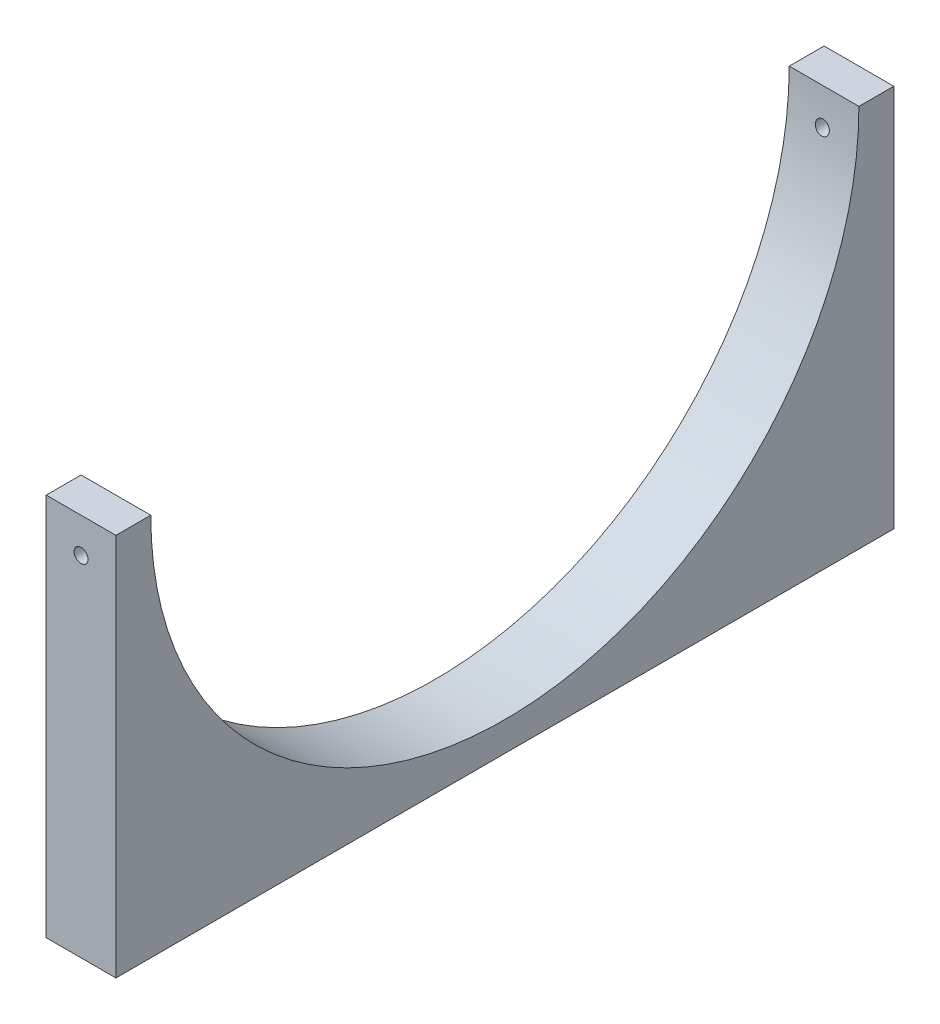
ISO-10303-21;
HEADER;
FILE_DESCRIPTION(('STEP AP214'),'2;1');
FILE_NAME('part.step','',(''),(''),'','','');
FILE_SCHEMA(('AUTOMOTIVE_DESIGN { 1 0 10303 214 1 1 1 1 }'));
ENDSEC;
DATA;
#1=APPLICATION_CONTEXT('core data for automotive mechanical design processes');
#2=APPLICATION_PROTOCOL_DEFINITION('international standard','automotive_design',2000,#1);
#3=PRODUCT_CONTEXT('',#1,'mechanical');
#4=PRODUCT('Part','Part','',(#3));
#5=PRODUCT_RELATED_PRODUCT_CATEGORY('part','',(#4));
#6=PRODUCT_DEFINITION_FORMATION('','',#4);
#7=PRODUCT_DEFINITION_CONTEXT('part definition',#1,'design');
#8=PRODUCT_DEFINITION('design','',#6,#7);
#9=PRODUCT_DEFINITION_SHAPE('','',#8);
#10=(LENGTH_UNIT() NAMED_UNIT(*) SI_UNIT(.MILLI.,.METRE.));
#11=(NAMED_UNIT(*) PLANE_ANGLE_UNIT() SI_UNIT($,.RADIAN.));
#12=(NAMED_UNIT(*) SI_UNIT($,.STERADIAN.) SOLID_ANGLE_UNIT());
#13=UNCERTAINTY_MEASURE_WITH_UNIT(LENGTH_MEASURE(1.E-05),#10,'distance_accuracy_value','');
#14=(GEOMETRIC_REPRESENTATION_CONTEXT(3) GLOBAL_UNCERTAINTY_ASSIGNED_CONTEXT((#13)) GLOBAL_UNIT_ASSIGNED_CONTEXT((#10,
#11,#12)) REPRESENTATION_CONTEXT('',''));
#15=CARTESIAN_POINT('',(0.,0.,0.));
#16=DIRECTION('',(0.,0.,1.));
#17=DIRECTION('',(1.,0.,0.));
#18=AXIS2_PLACEMENT_3D('',#15,#16,#17);
#19=CARTESIAN_POINT('',(-68.4090909090909,80.,57.85));
#20=DIRECTION('',(1.,0.,0.));
#21=DIRECTION('',(0.,0.,-1.));
#22=AXIS2_PLACEMENT_3D('',#19,#20,#21);
#23=PLANE('',#22);
#24=DIRECTION('',(0.,-1.,0.));
#25=VECTOR('',#24,1.);
#26=CARTESIAN_POINT('',(-68.4090909090909,80.,57.85));
#27=LINE('',#26,#25);
#28=CARTESIAN_POINT('',(-68.4090909090909,55.,57.85));
#29=VERTEX_POINT('',#28);
#30=CARTESIAN_POINT('',(-68.4090909090909,0.,57.85));
#31=VERTEX_POINT('',#30);
#32=EDGE_CURVE('E45',#29,#31,#27,.T.);
#33=ORIENTED_EDGE('',*,*,#32,.F.);
#34=DIRECTION('',(0.,0.,1.));
#35=VECTOR('',#34,1.);
#36=CARTESIAN_POINT('',(-68.4090909090909,55.,0.));
#37=LINE('',#36,#35);
#38=CARTESIAN_POINT('',(-68.4090909090909,55.,52.85));
#39=VERTEX_POINT('',#38);
#40=EDGE_CURVE('E107',#39,#29,#37,.T.);
#41=ORIENTED_EDGE('',*,*,#40,.F.);
#42=CARTESIAN_POINT('',(-68.4090909090909,55.,2.04999999999999));
#43=DIRECTION('',(-1.,0.,0.));
#44=DIRECTION('',(0.,0.,1.));
#45=AXIS2_PLACEMENT_3D('',#42,#43,#44);
#46=CIRCLE('',#45,50.8);
#47=CARTESIAN_POINT('',(-68.4090909090909,55.,-48.75));
#48=VERTEX_POINT('',#47);
#49=EDGE_CURVE('E186',#48,#39,#46,.T.);
#50=ORIENTED_EDGE('',*,*,#49,.F.);
#51=DIRECTION('',(0.,0.,1.));
#52=VECTOR('',#51,1.);
#53=CARTESIAN_POINT('',(-68.4090909090909,55.,0.));
#54=LINE('',#53,#52);
#55=CARTESIAN_POINT('',(-68.4090909090909,55.,-53.75));
#56=VERTEX_POINT('',#55);
#57=EDGE_CURVE('E180',#56,#48,#54,.T.);
#58=ORIENTED_EDGE('',*,*,#57,.F.);
#59=DIRECTION('',(0.,-1.,0.));
#60=VECTOR('',#59,1.);
#61=CARTESIAN_POINT('',(-68.4090909090909,80.,-53.75));
#62=LINE('',#61,#60);
#63=CARTESIAN_POINT('',(-68.4090909090909,0.,-53.75));
#64=VERTEX_POINT('',#63);
#65=EDGE_CURVE('E124',#56,#64,#62,.T.);
#66=ORIENTED_EDGE('',*,*,#65,.T.);
#67=DIRECTION('',(0.,0.,1.));
#68=VECTOR('',#67,1.);
#69=CARTESIAN_POINT('',(-68.4090909090909,0.,57.85));
#70=LINE('',#69,#68);
#71=EDGE_CURVE('E109',#64,#31,#70,.T.);
#72=ORIENTED_EDGE('',*,*,#71,.T.);
#73=EDGE_LOOP('',(#33,#41,#50,#58,#66,#72));
#74=FACE_BOUND('',#73,.T.);
#75=ADVANCED_FACE('F32',(#74),#23,.F.);
#76=CARTESIAN_POINT('',(-68.4090909090909,80.,57.85));
#77=DIRECTION('',(0.,0.,-1.));
#78=DIRECTION('',(-1.,0.,0.));
#79=AXIS2_PLACEMENT_3D('',#76,#77,#78);
#80=PLANE('',#79);
#81=CARTESIAN_POINT('',(-63.4090909090909,50.,57.85));
#82=DIRECTION('',(0.,0.,-1.));
#83=DIRECTION('',(-1.,0.,0.));
#84=AXIS2_PLACEMENT_3D('',#81,#82,#83);
#85=CIRCLE('',#84,0.999999999999998);
#86=CARTESIAN_POINT('',(-64.4090909090909,50.,57.85));
#87=VERTEX_POINT('',#86);
#88=EDGE_CURVE('E202',#87,#87,#85,.T.);
#89=ORIENTED_EDGE('',*,*,#88,.T.);
#90=EDGE_LOOP('',(#89));
#91=FACE_BOUND('',#90,.T.);
#92=DIRECTION('',(1.,0.,0.));
#93=VECTOR('',#92,1.);
#94=CARTESIAN_POINT('',(-68.4090909090909,0.,57.85));
#95=LINE('',#94,#93);
#96=CARTESIAN_POINT('',(-58.4090909090909,0.,57.85));
#97=VERTEX_POINT('',#96);
#98=EDGE_CURVE('E102',#31,#97,#95,.T.);
#99=ORIENTED_EDGE('',*,*,#98,.T.);
#100=DIRECTION('',(0.,1.,0.));
#101=VECTOR('',#100,1.);
#102=CARTESIAN_POINT('',(-58.4090909090909,80.,57.85));
#103=LINE('',#102,#101);
#104=CARTESIAN_POINT('',(-58.4090909090909,55.,57.85));
#105=VERTEX_POINT('',#104);
#106=EDGE_CURVE('E91',#97,#105,#103,.T.);
#107=ORIENTED_EDGE('',*,*,#106,.T.);
#108=DIRECTION('',(-1.,0.,0.));
#109=VECTOR('',#108,1.);
#110=CARTESIAN_POINT('',(121.090909090909,55.,57.85));
#111=LINE('',#110,#109);
#112=EDGE_CURVE('E99',#105,#29,#111,.T.);
#113=ORIENTED_EDGE('',*,*,#112,.T.);
#114=ORIENTED_EDGE('',*,*,#32,.T.);
#115=EDGE_LOOP('',(#99,#107,#113,#114));
#116=FACE_BOUND('',#115,.T.);
#117=ADVANCED_FACE('F98',(#91,#116),#80,.F.);
#118=CARTESIAN_POINT('',(-68.4090909090909,80.,-53.75));
#119=DIRECTION('',(0.,0.,1.));
#120=DIRECTION('',(1.,0.,0.));
#121=AXIS2_PLACEMENT_3D('',#118,#119,#120);
#122=PLANE('',#121);
#123=CARTESIAN_POINT('',(-63.4090909090909,50.,-53.75));
#124=DIRECTION('',(0.,0.,1.));
#125=DIRECTION('',(1.,0.,0.));
#126=AXIS2_PLACEMENT_3D('',#123,#124,#125);
#127=CIRCLE('',#126,0.999999999999998);
#128=CARTESIAN_POINT('',(-62.4090909090909,50.,-53.75));
#129=VERTEX_POINT('',#128);
#130=EDGE_CURVE('E131',#129,#129,#127,.T.);
#131=ORIENTED_EDGE('',*,*,#130,.T.);
#132=EDGE_LOOP('',(#131));
#133=FACE_BOUND('',#132,.T.);
#134=DIRECTION('',(-1.,0.,0.));
#135=VECTOR('',#134,1.);
#136=CARTESIAN_POINT('',(121.090909090909,55.,-53.75));
#137=LINE('',#136,#135);
#138=CARTESIAN_POINT('',(-58.4090909090909,55.,-53.75));
#139=VERTEX_POINT('',#138);
#140=EDGE_CURVE('E120',#139,#56,#137,.T.);
#141=ORIENTED_EDGE('',*,*,#140,.F.);
#142=DIRECTION('',(0.,-1.,0.));
#143=VECTOR('',#142,1.);
#144=CARTESIAN_POINT('',(-58.4090909090909,80.,-53.75));
#145=LINE('',#144,#143);
#146=CARTESIAN_POINT('',(-58.4090909090909,0.,-53.75));
#147=VERTEX_POINT('',#146);
#148=EDGE_CURVE('E178',#139,#147,#145,.T.);
#149=ORIENTED_EDGE('',*,*,#148,.T.);
#150=DIRECTION('',(-1.,0.,0.));
#151=VECTOR('',#150,1.);
#152=CARTESIAN_POINT('',(-68.4090909090909,0.,-53.75));
#153=LINE('',#152,#151);
#154=EDGE_CURVE('E60',#147,#64,#153,.T.);
#155=ORIENTED_EDGE('',*,*,#154,.T.);
#156=ORIENTED_EDGE('',*,*,#65,.F.);
#157=EDGE_LOOP('',(#141,#149,#155,#156));
#158=FACE_BOUND('',#157,.T.);
#159=ADVANCED_FACE('F171',(#133,#158),#122,.F.);
#160=CARTESIAN_POINT('',(0.,0.,0.));
#161=DIRECTION('',(0.,-1.,0.));
#162=DIRECTION('',(0.,0.,-1.));
#163=AXIS2_PLACEMENT_3D('',#160,#161,#162);
#164=PLANE('',#163);
#165=CARTESIAN_POINT('',(-63.4090909090909,0.,42.85));
#166=DIRECTION('',(0.,-1.,0.));
#167=DIRECTION('',(0.,0.,-1.));
#168=AXIS2_PLACEMENT_3D('',#165,#166,#167);
#169=CIRCLE('',#168,2.);
#170=CARTESIAN_POINT('',(-63.4090909090909,0.,40.85));
#171=VERTEX_POINT('',#170);
#172=EDGE_CURVE('E195',#171,#171,#169,.T.);
#173=ORIENTED_EDGE('',*,*,#172,.F.);
#174=EDGE_LOOP('',(#173));
#175=FACE_BOUND('',#174,.T.);
#176=CARTESIAN_POINT('',(-63.4090909090909,0.,-38.75));
#177=DIRECTION('',(0.,-1.,0.));
#178=DIRECTION('',(0.,0.,-1.));
#179=AXIS2_PLACEMENT_3D('',#176,#177,#178);
#180=CIRCLE('',#179,2.);
#181=CARTESIAN_POINT('',(-63.4090909090909,0.,-40.75));
#182=VERTEX_POINT('',#181);
#183=EDGE_CURVE('E198',#182,#182,#180,.T.);
#184=ORIENTED_EDGE('',*,*,#183,.F.);
#185=EDGE_LOOP('',(#184));
#186=FACE_BOUND('',#185,.T.);
#187=DIRECTION('',(0.,0.,-1.));
#188=VECTOR('',#187,1.);
#189=CARTESIAN_POINT('',(-58.4090909090909,0.,0.));
#190=LINE('',#189,#188);
#191=EDGE_CURVE('E177',#97,#147,#190,.T.);
#192=ORIENTED_EDGE('',*,*,#191,.F.);
#193=ORIENTED_EDGE('',*,*,#98,.F.);
#194=ORIENTED_EDGE('',*,*,#71,.F.);
#195=ORIENTED_EDGE('',*,*,#154,.F.);
#196=EDGE_LOOP('',(#192,#193,#194,#195));
#197=FACE_BOUND('',#196,.T.);
#198=ADVANCED_FACE('F176',(#175,#186,#197),#164,.T.);
#199=CARTESIAN_POINT('',(121.090909090909,55.,2.04999999999999));
#200=DIRECTION('',(-1.,0.,0.));
#201=DIRECTION('',(0.,0.,1.));
#202=AXIS2_PLACEMENT_3D('',#199,#200,#201);
#203=CYLINDRICAL_SURFACE('',#202,50.8);
#204=CARTESIAN_POINT('',(-62.4090909090909,50.,-48.5033381687105));
#205=CARTESIAN_POINT('',(-62.4090933874529,49.9435620160366,-48.497756008445));
#206=CARTESIAN_POINT('',(-62.413884475844,49.8870923508728,-48.4920745278555));
#207=CARTESIAN_POINT('',(-62.4329253949911,49.7757242294883,-48.4806846062044));
#208=CARTESIAN_POINT('',(-62.4471867918813,49.7208277802709,-48.4749761406609));
#209=CARTESIAN_POINT('',(-62.484767817317,49.6142309306179,-48.4637245007275));
#210=CARTESIAN_POINT('',(-62.5080835130466,49.5625291538337,-48.4581812556967));
#211=CARTESIAN_POINT('',(-62.5631180058667,49.4637872045508,-48.4474535739106));
#212=CARTESIAN_POINT('',(-62.5948346364843,49.4167458344956,-48.4422690450821));
#213=CARTESIAN_POINT('',(-62.6657439697373,49.3287135166166,-48.4324570737672));
#214=CARTESIAN_POINT('',(-62.704927167469,49.2877149927041,-48.4278289350848));
#215=CARTESIAN_POINT('',(-62.7896982780352,49.2128856180934,-48.4193048216092));
#216=CARTESIAN_POINT('',(-62.83528628288,49.1790548703838,-48.4154088573361));
#217=CARTESIAN_POINT('',(-62.9313162123638,49.1197158630582,-48.4085290049929));
#218=CARTESIAN_POINT('',(-62.9817310717293,49.0941643566381,-48.405540382743));
#219=CARTESIAN_POINT('',(-63.0861833304611,49.051894219118,-48.4005747575919));
#220=CARTESIAN_POINT('',(-63.1402205823634,49.035175228701,-48.3985977135387));
#221=CARTESIAN_POINT('',(-63.2500200355732,49.0111445384663,-48.3957506360004));
#222=CARTESIAN_POINT('',(-63.3057693018917,49.0037745306039,-48.3948737414468));
#223=CARTESIAN_POINT('',(-63.4177205921215,48.9984683671669,-48.3942427405686));
#224=CARTESIAN_POINT('',(-63.4739226038204,49.0005319579756,-48.3944886040593));
#225=CARTESIAN_POINT('',(-63.5849828771889,49.0140078552024,-48.3960894700018));
#226=CARTESIAN_POINT('',(-63.6398450586884,49.0253883445857,-48.3974406976435));
#227=CARTESIAN_POINT('',(-63.7468716775122,49.0571216171105,-48.4011887835919));
#228=CARTESIAN_POINT('',(-63.7990361023978,49.0774744416172,-48.4035856467192));
#229=CARTESIAN_POINT('',(-63.8992882253376,49.1265998439225,-48.4093279794881));
#230=CARTESIAN_POINT('',(-63.9473689160589,49.1553865314657,-48.4126750385018));
#231=CARTESIAN_POINT('',(-64.0380184983337,49.2205349309665,-48.420177879442));
#232=CARTESIAN_POINT('',(-64.0805872371506,49.2568968527616,-48.4243336837709));
#233=CARTESIAN_POINT('',(-64.1592636171734,49.3363845366288,-48.4333147166642));
#234=CARTESIAN_POINT('',(-64.1953335199109,49.3795472386392,-48.4381435835443));
#235=CARTESIAN_POINT('',(-64.2597234354509,49.4712618349689,-48.4482690752289));
#236=CARTESIAN_POINT('',(-64.2880431807607,49.5198139152188,-48.4535657161701));
#237=CARTESIAN_POINT('',(-64.3363032847134,49.6212510581529,-48.4644699514475));
#238=CARTESIAN_POINT('',(-64.3561918628569,49.6741605791374,-48.4700792345579));
#239=CARTESIAN_POINT('',(-64.3867884686701,49.7825616990377,-48.4813893093515));
#240=CARTESIAN_POINT('',(-64.3974963002978,49.8380533530647,-48.4870901029861));
#241=CARTESIAN_POINT('',(-64.4094485699878,49.950235631553,-48.49842299441));
#242=CARTESIAN_POINT('',(-64.4106626810285,50.0069295186852,-48.5040548147189));
#243=CARTESIAN_POINT('',(-64.4035042059924,50.1197338342296,-48.5150691107452));
#244=CARTESIAN_POINT('',(-64.3951316172971,50.1758442624823,-48.5204515863945));
#245=CARTESIAN_POINT('',(-64.3690319983901,50.2858426935729,-48.5308241558067));
#246=CARTESIAN_POINT('',(-64.3513114727351,50.339732213705,-48.5358145196412));
#247=CARTESIAN_POINT('',(-64.3070070254242,50.4437835800137,-48.5452925057123));
#248=CARTESIAN_POINT('',(-64.280423244328,50.49394548529,-48.5497801359202));
#249=CARTESIAN_POINT('',(-64.2192384233192,50.5889328787078,-48.5581491074431));
#250=CARTESIAN_POINT('',(-64.1846644441443,50.6337756226786,-48.5620324227539));
#251=CARTESIAN_POINT('',(-64.1084234462943,50.7170212080948,-48.5691450105825));
#252=CARTESIAN_POINT('',(-64.0667565720441,50.7554241806346,-48.5723742964145));
#253=CARTESIAN_POINT('',(-63.9776896219598,50.8245364927184,-48.5781216911418));
#254=CARTESIAN_POINT('',(-63.9303127820543,50.8552755493827,-48.5806425519773));
#255=CARTESIAN_POINT('',(-63.8310412032617,50.9083645111594,-48.5849605665126));
#256=CARTESIAN_POINT('',(-63.779146547988,50.9307145714905,-48.5867577336028));
#257=CARTESIAN_POINT('',(-63.672483766756,50.9663207553611,-48.5896065548862));
#258=CARTESIAN_POINT('',(-63.6177249194976,50.9796044969548,-48.5906604735115));
#259=CARTESIAN_POINT('',(-63.5067461779858,50.9968030716875,-48.5920229649742));
#260=CARTESIAN_POINT('',(-63.4505262968954,51.0007179892047,-48.5923315445243));
#261=CARTESIAN_POINT('',(-63.3383160847669,50.9990668005034,-48.5922011176231));
#262=CARTESIAN_POINT('',(-63.2823255313888,50.9935156641947,-48.591763291561));
#263=CARTESIAN_POINT('',(-63.1720742494544,50.9731217272199,-48.5901456813805));
#264=CARTESIAN_POINT('',(-63.1178135190194,50.9582789366454,-48.588965898068));
#265=CARTESIAN_POINT('',(-63.0125585268903,50.9197300402157,-48.5858743230843));
#266=CARTESIAN_POINT('',(-62.9615643549932,50.8960236908255,-48.5839625113));
#267=CARTESIAN_POINT('',(-62.8642862684319,50.8404321248854,-48.5794259246));
#268=CARTESIAN_POINT('',(-62.8180021908591,50.8085471913436,-48.5768011743545));
#269=CARTESIAN_POINT('',(-62.7313777979121,50.737461193199,-48.5708655926282));
#270=CARTESIAN_POINT('',(-62.6910464262136,50.6982493164981,-48.5675537464183));
#271=CARTESIAN_POINT('',(-62.6175279340673,50.6136520986468,-48.5602929311535));
#272=CARTESIAN_POINT('',(-62.5843426783417,50.56826515119,-48.5563437962723));
#273=CARTESIAN_POINT('',(-62.5259459137532,50.4724561261601,-48.5478622664596));
#274=CARTESIAN_POINT('',(-62.5007630062593,50.4220168168641,-48.5433278590879));
#275=CARTESIAN_POINT('',(-62.4592464932739,50.3177099205252,-48.5337809112662));
#276=CARTESIAN_POINT('',(-62.4429025641719,50.2638464153886,-48.5287689366837));
#277=CARTESIAN_POINT('',(-62.4238424227185,50.1747056508709,-48.5203246170645));
#278=CARTESIAN_POINT('',(-62.4183167333322,50.1399935169105,-48.5170007631042));
#279=CARTESIAN_POINT('',(-62.4109402030392,50.0701916740887,-48.5102434691279));
#280=CARTESIAN_POINT('',(-62.4090893676579,50.0351019646597,-48.5068100289472));
#281=CARTESIAN_POINT('',(-62.4090909090909,50.,-48.5033381687105));
#282=B_SPLINE_CURVE_WITH_KNOTS('',3,(#204,#205,#206,#207,#208,#209,#210,#211,#212,#213,#214,
#215,#216,#217,#218,#219,#220,#221,#222,#223,#224,#225,#226,#227,#228,#229,#230,#231,#232,#233,
#234,#235,#236,#237,#238,#239,#240,#241,#242,#243,#244,#245,#246,#247,#248,#249,#250,#251,#252,
#253,#254,#255,#256,#257,#258,#259,#260,#261,#262,#263,#264,#265,#266,#267,#268,#269,#270,#271,
#272,#273,#274,#275,#276,#277,#278,#279,#280,#281),.UNSPECIFIED.,.T.,.F.,(4,2,2,2,2,2,2,2,2,2,2,
2,2,2,2,2,2,2,2,2,2,2,2,2,2,2,2,2,2,2,2,2,2,2,2,2,2,2,4),(0.,0.170011432086972,0.3402308827848,
0.51037647968419,0.680478241276961,0.850364893502281,1.02025398653811,1.18924079168185,
1.35822072171763,1.52614148555128,1.69405773496091,1.86140293377574,2.02874890410928,
2.19637645657235,2.36400865301286,2.532584937337,2.70116703925283,2.87077000292714,
3.04037658814256,3.21052474919578,3.3806729567239,3.55070292622229,3.72073019939601,
3.89018986084601,4.05964607218628,4.22843461782675,4.3972200402775,4.56548898151238,
4.73375640726631,4.90175797643265,5.06975936313397,5.23776536617478,5.40576555639415,
5.57401564465224,5.74230958337916,5.91119843058743,6.07988959330584,6.18562913056223,
6.29136882680536),.UNSPECIFIED.);
#283=CARTESIAN_POINT('',(-62.4090909090909,50.,-48.5033381687105));
#284=VERTEX_POINT('',#283);
#285=EDGE_CURVE('E35',#284,#284,#282,.T.);
#286=ORIENTED_EDGE('',*,*,#285,.T.);
#287=EDGE_LOOP('',(#286));
#288=FACE_BOUND('',#287,.T.);
#289=CARTESIAN_POINT('',(-62.4090909090909,50.,52.6033381687105));
#290=CARTESIAN_POINT('',(-62.4090933602506,50.0562997849528,52.6089063890358));
#291=CARTESIAN_POINT('',(-62.413860916404,50.112649146675,52.614383798981));
#292=CARTESIAN_POINT('',(-62.43282664405,50.2238183909001,52.6250058589013));
#293=CARTESIAN_POINT('',(-62.4470359135926,50.2786363942931,52.6301501094531));
#294=CARTESIAN_POINT('',(-62.4845011098888,50.3851191479942,52.6399766050367));
#295=CARTESIAN_POINT('',(-62.5077540985809,50.4367849160791,52.6446589994945));
#296=CARTESIAN_POINT('',(-62.5626567968221,50.5354788349117,52.6534634051067));
#297=CARTESIAN_POINT('',(-62.5943043691291,50.5825081619125,52.6575855584936));
#298=CARTESIAN_POINT('',(-62.665015459498,50.670468023334,52.6651864563965));
#299=CARTESIAN_POINT('',(-62.7040590410302,50.7114144371313,52.6686668820816));
#300=CARTESIAN_POINT('',(-62.7885157282951,50.786172272218,52.6749451052399));
#301=CARTESIAN_POINT('',(-62.8339289599494,50.8199835524198,52.6777428892151));
#302=CARTESIAN_POINT('',(-62.9296482202542,50.8793719439064,52.6826111532725));
#303=CARTESIAN_POINT('',(-62.9799350073036,50.9049798464503,52.6846843557937));
#304=CARTESIAN_POINT('',(-63.0841160089959,50.9473934241561,52.6880966797946));
#305=CARTESIAN_POINT('',(-63.1380101589003,50.9641992572341,52.6894358144442));
#306=CARTESIAN_POINT('',(-63.2477235144,50.9884882813775,52.6913657332408));
#307=CARTESIAN_POINT('',(-63.3035372840691,50.9959958757888,52.6919584763705));
#308=CARTESIAN_POINT('',(-63.4156363044325,51.0015519635525,52.6923974697552));
#309=CARTESIAN_POINT('',(-63.4719215503458,50.9996005527069,52.6922437275707));
#310=CARTESIAN_POINT('',(-63.5833013719228,50.986302646999,52.6911915048387));
#311=CARTESIAN_POINT('',(-63.6383971764172,50.9749663763752,52.6902938347546));
#312=CARTESIAN_POINT('',(-63.745898990175,50.9432396981965,52.6877620655806));
#313=CARTESIAN_POINT('',(-63.7983049990619,50.9228492893747,52.6861279663876));
#314=CARTESIAN_POINT('',(-63.8989703365369,50.8735901302622,52.682137515951));
#315=CARTESIAN_POINT('',(-63.9472275801006,50.844717148753,52.6797808042333));
#316=CARTESIAN_POINT('',(-64.0382065254137,50.7793278314487,52.6743715921474));
#317=CARTESIAN_POINT('',(-64.0809281880644,50.7428114416718,52.6713190868653));
#318=CARTESIAN_POINT('',(-64.1597219565696,50.6630988945807,52.6645521389129));
#319=CARTESIAN_POINT('',(-64.1957801068409,50.619889059021,52.6608363383564));
#320=CARTESIAN_POINT('',(-64.260133443276,50.5280807899814,52.6528068240517));
#321=CARTESIAN_POINT('',(-64.2884285013826,50.4794822676304,52.648493100442));
#322=CARTESIAN_POINT('',(-64.3365591121088,50.3781032118423,52.639333522844));
#323=CARTESIAN_POINT('',(-64.3563653152016,50.3253089056262,52.634485894368));
#324=CARTESIAN_POINT('',(-64.3868366210925,50.2171830711557,52.6243769995525));
#325=CARTESIAN_POINT('',(-64.3975015168403,50.1618514854619,52.6191157238469));
#326=CARTESIAN_POINT('',(-64.4094294611257,50.0499900308007,52.6082888386069));
#327=CARTESIAN_POINT('',(-64.410655220781,49.9934562931142,52.6027221094533));
#328=CARTESIAN_POINT('',(-64.40358243397,49.8810004979699,52.5914586069679));
#329=CARTESIAN_POINT('',(-64.3952836935362,49.8250784529926,52.58576183099));
#330=CARTESIAN_POINT('',(-64.369361885975,49.7152707562565,52.5743970119824));
#331=CARTESIAN_POINT('',(-64.3517132176016,49.6613911330744,52.5687290911932));
#332=CARTESIAN_POINT('',(-64.3075689160252,49.5573601047068,52.5576272477733));
#333=CARTESIAN_POINT('',(-64.281073242988,49.5072087163093,52.5521933261962));
#334=CARTESIAN_POINT('',(-64.21998559024,49.4120855176054,52.5417567882681));
#335=CARTESIAN_POINT('',(-64.1853970629881,49.3671115107707,52.5367539892394));
#336=CARTESIAN_POINT('',(-64.1090841209749,49.2836145427669,52.5273682566859));
#337=CARTESIAN_POINT('',(-64.0673598459588,49.2450914552934,52.522985311025));
#338=CARTESIAN_POINT('',(-63.9781459919739,49.175770865463,52.5150331487933));
#339=CARTESIAN_POINT('',(-63.9306820833039,49.1449407249983,52.5114605005444));
#340=CARTESIAN_POINT('',(-63.8311911828251,49.0916970175241,52.5052542121493));
#341=CARTESIAN_POINT('',(-63.7791643658588,49.0692831281929,52.5026205360431));
#342=CARTESIAN_POINT('',(-63.6723800469482,49.0336528371568,52.4984194355026));
#343=CARTESIAN_POINT('',(-63.6176420575497,49.0203787385712,52.4968453237828));
#344=CARTESIAN_POINT('',(-63.506695771206,49.0031930443655,52.4948053078087));
#345=CARTESIAN_POINT('',(-63.450487518473,48.9992811675418,52.4943393702691));
#346=CARTESIAN_POINT('',(-63.3384767969801,49.0009322425648,52.4945357438879));
#347=CARTESIAN_POINT('',(-63.2826736604839,49.0064509193251,52.4951927828364));
#348=CARTESIAN_POINT('',(-63.1727934226116,49.0267145627372,52.4975962143208));
#349=CARTESIAN_POINT('',(-63.1187163146682,49.0414594942795,52.4993426027111));
#350=CARTESIAN_POINT('',(-63.0138130489153,49.079742828608,52.5038494466287));
#351=CARTESIAN_POINT('',(-62.9629870642133,49.1032816991758,52.5066099561005));
#352=CARTESIAN_POINT('',(-62.8660116970514,49.1584672027646,52.513028673674));
#353=CARTESIAN_POINT('',(-62.819862233754,49.1901136956052,52.5166868662547));
#354=CARTESIAN_POINT('',(-62.733314792525,49.2607694775497,52.524770922476));
#355=CARTESIAN_POINT('',(-62.6929442135524,49.2998119264897,52.5292002359078));
#356=CARTESIAN_POINT('',(-62.6193108808404,49.3840631924018,52.5386427522097));
#357=CARTESIAN_POINT('',(-62.5860501223586,49.4292737345345,52.5436561183766));
#358=CARTESIAN_POINT('',(-62.5273599650383,49.524899555009,52.5541147103282));
#359=CARTESIAN_POINT('',(-62.5019854992946,49.575348213612,52.5595626471668));
#360=CARTESIAN_POINT('',(-62.4601002802321,49.6797306449805,52.5706638679254));
#361=CARTESIAN_POINT('',(-62.4435792830014,49.7336603087054,52.5763169064073));
#362=CARTESIAN_POINT('',(-62.4241899056823,49.8232671063425,52.5855583884836));
#363=CARTESIAN_POINT('',(-62.4185353081544,49.8583664562021,52.5891418920766));
#364=CARTESIAN_POINT('',(-62.410985029956,49.9289706234751,52.5962750387345));
#365=CARTESIAN_POINT('',(-62.4090893624356,49.9644754423066,52.599824681681));
#366=CARTESIAN_POINT('',(-62.4090909090909,50.,52.6033381687105));
#367=B_SPLINE_CURVE_WITH_KNOTS('',3,(#289,#290,#291,#292,#293,#294,#295,#296,#297,#298,#299,
#300,#301,#302,#303,#304,#305,#306,#307,#308,#309,#310,#311,#312,#313,#314,#315,#316,#317,#318,
#319,#320,#321,#322,#323,#324,#325,#326,#327,#328,#329,#330,#331,#332,#333,#334,#335,#336,#337,
#338,#339,#340,#341,#342,#343,#344,#345,#346,#347,#348,#349,#350,#351,#352,#353,#354,#355,#356,
#357,#358,#359,#360,#361,#362,#363,#364,#365,#366),.UNSPECIFIED.,.T.,.F.,(4,2,2,2,2,2,2,2,2,2,2,
2,2,2,2,2,2,2,2,2,2,2,2,2,2,2,2,2,2,2,2,2,2,2,2,2,2,2,4),(0.,0.169593693195951,
0.339387084958484,0.509125361421744,0.678820464311564,0.848064487257577,1.01731185646059,
1.18591630520667,1.35451772895392,1.52267571193737,1.69083199179944,1.85880531624904,
2.0267786642025,2.19483594213814,2.36289440702586,2.53130094846913,2.6997102677173,
2.86869724133089,3.03768804239442,3.20734609323065,3.37700759923292,3.5471360786044,
3.71726532400289,3.88732212317922,4.05737559237346,4.22669483281742,4.39600758808753,
4.56424147208819,4.73247030295355,4.89991149193491,5.06735204374255,5.23480150359107,
5.40224806844136,5.57046395488653,5.73872698663706,5.90813708858198,6.07735074890108,
6.18436216762571,6.29137396071568),.UNSPECIFIED.);
#368=CARTESIAN_POINT('',(-62.4090909090909,50.,52.6033381687105));
#369=VERTEX_POINT('',#368);
#370=EDGE_CURVE('E126',#369,#369,#367,.T.);
#371=ORIENTED_EDGE('',*,*,#370,.T.);
#372=EDGE_LOOP('',(#371));
#373=FACE_BOUND('',#372,.T.);
#374=DIRECTION('',(-1.,0.,0.));
#375=VECTOR('',#374,1.);
#376=CARTESIAN_POINT('',(121.090909090909,55.,52.85));
#377=LINE('',#376,#375);
#378=CARTESIAN_POINT('',(-58.4090909090909,55.,52.85));
#379=VERTEX_POINT('',#378);
#380=EDGE_CURVE('E110',#379,#39,#377,.T.);
#381=ORIENTED_EDGE('',*,*,#380,.F.);
#382=CARTESIAN_POINT('',(-58.4090909090909,55.,2.04999999999999));
#383=DIRECTION('',(-1.,0.,0.));
#384=DIRECTION('',(0.,0.,1.));
#385=AXIS2_PLACEMENT_3D('',#382,#383,#384);
#386=CIRCLE('',#385,50.8);
#387=CARTESIAN_POINT('',(-58.4090909090909,55.,-48.75));
#388=VERTEX_POINT('',#387);
#389=EDGE_CURVE('E53',#379,#388,#386,.F.);
#390=ORIENTED_EDGE('',*,*,#389,.T.);
#391=DIRECTION('',(-1.,0.,0.));
#392=VECTOR('',#391,1.);
#393=CARTESIAN_POINT('',(121.090909090909,55.,-48.75));
#394=LINE('',#393,#392);
#395=EDGE_CURVE('E114',#388,#48,#394,.T.);
#396=ORIENTED_EDGE('',*,*,#395,.T.);
#397=ORIENTED_EDGE('',*,*,#49,.T.);
#398=EDGE_LOOP('',(#381,#390,#396,#397));
#399=FACE_BOUND('',#398,.T.);
#400=ADVANCED_FACE('F132',(#288,#373,#399),#203,.F.);
#401=CARTESIAN_POINT('',(121.090909090909,55.,0.));
#402=DIRECTION('',(0.,-1.,0.));
#403=DIRECTION('',(0.,0.,-1.));
#404=AXIS2_PLACEMENT_3D('',#401,#402,#403);
#405=PLANE('',#404);
#406=ORIENTED_EDGE('',*,*,#395,.F.);
#407=DIRECTION('',(0.,0.,-1.));
#408=VECTOR('',#407,1.);
#409=CARTESIAN_POINT('',(-58.4090909090909,55.,0.));
#410=LINE('',#409,#408);
#411=EDGE_CURVE('E103',#388,#139,#410,.T.);
#412=ORIENTED_EDGE('',*,*,#411,.T.);
#413=ORIENTED_EDGE('',*,*,#140,.T.);
#414=ORIENTED_EDGE('',*,*,#57,.T.);
#415=EDGE_LOOP('',(#406,#412,#413,#414));
#416=FACE_BOUND('',#415,.T.);
#417=ADVANCED_FACE('F161',(#416),#405,.F.);
#418=CARTESIAN_POINT('',(121.090909090909,55.,0.));
#419=DIRECTION('',(0.,-1.,0.));
#420=DIRECTION('',(0.,0.,-1.));
#421=AXIS2_PLACEMENT_3D('',#418,#419,#420);
#422=PLANE('',#421);
#423=ORIENTED_EDGE('',*,*,#112,.F.);
#424=DIRECTION('',(0.,0.,-1.));
#425=VECTOR('',#424,1.);
#426=CARTESIAN_POINT('',(-58.4090909090909,55.,0.));
#427=LINE('',#426,#425);
#428=EDGE_CURVE('E11',#105,#379,#427,.T.);
#429=ORIENTED_EDGE('',*,*,#428,.T.);
#430=ORIENTED_EDGE('',*,*,#380,.T.);
#431=ORIENTED_EDGE('',*,*,#40,.T.);
#432=EDGE_LOOP('',(#423,#429,#430,#431));
#433=FACE_BOUND('',#432,.T.);
#434=ADVANCED_FACE('F105',(#433),#422,.F.);
#435=CARTESIAN_POINT('',(-58.4090909090909,41.1510110415607,5.89940801880573));
#436=DIRECTION('',(-1.,0.,0.));
#437=DIRECTION('',(0.,0.,1.));
#438=AXIS2_PLACEMENT_3D('',#435,#436,#437);
#439=PLANE('',#438);
#440=ORIENTED_EDGE('',*,*,#411,.F.);
#441=ORIENTED_EDGE('',*,*,#389,.F.);
#442=ORIENTED_EDGE('',*,*,#428,.F.);
#443=ORIENTED_EDGE('',*,*,#106,.F.);
#444=ORIENTED_EDGE('',*,*,#191,.T.);
#445=ORIENTED_EDGE('',*,*,#148,.F.);
#446=EDGE_LOOP('',(#440,#441,#442,#443,#444,#445));
#447=FACE_BOUND('',#446,.T.);
#448=ADVANCED_FACE('F90',(#447),#439,.F.);
#449=CARTESIAN_POINT('',(-63.4090909090909,15.,-38.75));
#450=DIRECTION('',(0.,-1.,0.));
#451=DIRECTION('',(0.,0.,-1.));
#452=AXIS2_PLACEMENT_3D('',#449,#450,#451);
#453=CYLINDRICAL_SURFACE('',#452,2.);
#454=CARTESIAN_POINT('',(-63.4090909090909,15.,-38.75));
#455=DIRECTION('',(0.,-1.,0.));
#456=DIRECTION('',(0.,0.,-1.));
#457=AXIS2_PLACEMENT_3D('',#454,#455,#456);
#458=CIRCLE('',#457,2.);
#459=CARTESIAN_POINT('',(-63.4090909090909,15.,-40.75));
#460=VERTEX_POINT('',#459);
#461=EDGE_CURVE('E201',#460,#460,#458,.T.);
#462=ORIENTED_EDGE('',*,*,#461,.F.);
#463=EDGE_LOOP('',(#462));
#464=FACE_BOUND('',#463,.T.);
#465=ORIENTED_EDGE('',*,*,#183,.T.);
#466=EDGE_LOOP('',(#465));
#467=FACE_BOUND('',#466,.T.);
#468=ADVANCED_FACE('F154',(#464,#467),#453,.F.);
#469=CARTESIAN_POINT('',(-63.4090909090909,15.,-38.75));
#470=DIRECTION('',(0.,-1.,0.));
#471=DIRECTION('',(0.,0.,-1.));
#472=AXIS2_PLACEMENT_3D('',#469,#470,#471);
#473=PLANE('',#472);
#474=ORIENTED_EDGE('',*,*,#461,.T.);
#475=EDGE_LOOP('',(#474));
#476=FACE_BOUND('',#475,.T.);
#477=ADVANCED_FACE('F150',(#476),#473,.T.);
#478=CARTESIAN_POINT('',(-63.4090909090909,15.,42.85));
#479=DIRECTION('',(0.,-1.,0.));
#480=DIRECTION('',(0.,0.,-1.));
#481=AXIS2_PLACEMENT_3D('',#478,#479,#480);
#482=CYLINDRICAL_SURFACE('',#481,2.);
#483=CARTESIAN_POINT('',(-63.4090909090909,15.,42.85));
#484=DIRECTION('',(0.,-1.,0.));
#485=DIRECTION('',(0.,0.,-1.));
#486=AXIS2_PLACEMENT_3D('',#483,#484,#485);
#487=CIRCLE('',#486,2.);
#488=CARTESIAN_POINT('',(-63.4090909090909,15.,40.85));
#489=VERTEX_POINT('',#488);
#490=EDGE_CURVE('E192',#489,#489,#487,.T.);
#491=ORIENTED_EDGE('',*,*,#490,.F.);
#492=EDGE_LOOP('',(#491));
#493=FACE_BOUND('',#492,.T.);
#494=ORIENTED_EDGE('',*,*,#172,.T.);
#495=EDGE_LOOP('',(#494));
#496=FACE_BOUND('',#495,.T.);
#497=ADVANCED_FACE('F146',(#493,#496),#482,.F.);
#498=CARTESIAN_POINT('',(-63.4090909090909,15.,42.85));
#499=DIRECTION('',(0.,-1.,0.));
#500=DIRECTION('',(0.,0.,-1.));
#501=AXIS2_PLACEMENT_3D('',#498,#499,#500);
#502=PLANE('',#501);
#503=ORIENTED_EDGE('',*,*,#490,.T.);
#504=EDGE_LOOP('',(#503));
#505=FACE_BOUND('',#504,.T.);
#506=ADVANCED_FACE('F141',(#505),#502,.T.);
#507=CARTESIAN_POINT('',(-63.4090909090909,50.,-53.75));
#508=DIRECTION('',(0.,0.,1.));
#509=DIRECTION('',(1.,0.,0.));
#510=AXIS2_PLACEMENT_3D('',#507,#508,#509);
#511=CYLINDRICAL_SURFACE('',#510,0.999999999999998);
#512=ORIENTED_EDGE('',*,*,#370,.F.);
#513=EDGE_LOOP('',(#512));
#514=FACE_BOUND('',#513,.T.);
#515=ORIENTED_EDGE('',*,*,#88,.F.);
#516=EDGE_LOOP('',(#515));
#517=FACE_BOUND('',#516,.T.);
#518=ADVANCED_FACE('F136',(#514,#517),#511,.F.);
#519=ORIENTED_EDGE('',*,*,#130,.F.);
#520=EDGE_LOOP('',(#519));
#521=FACE_BOUND('',#520,.T.);
#522=ORIENTED_EDGE('',*,*,#285,.F.);
#523=EDGE_LOOP('',(#522));
#524=FACE_BOUND('',#523,.T.);
#525=ADVANCED_FACE('F140',(#521,#524),#511,.F.);
#526=CLOSED_SHELL('',(#75,#117,#159,#198,#400,#417,#434,#448,#468,#477,#497,#506,#518,#525));
#527=MANIFOLD_SOLID_BREP('B2',#526);
#528=ADVANCED_BREP_SHAPE_REPRESENTATION('',(#18,#527),#14);
#529=SHAPE_DEFINITION_REPRESENTATION(#9,#528);
ENDSEC;
END-ISO-10303-21;
